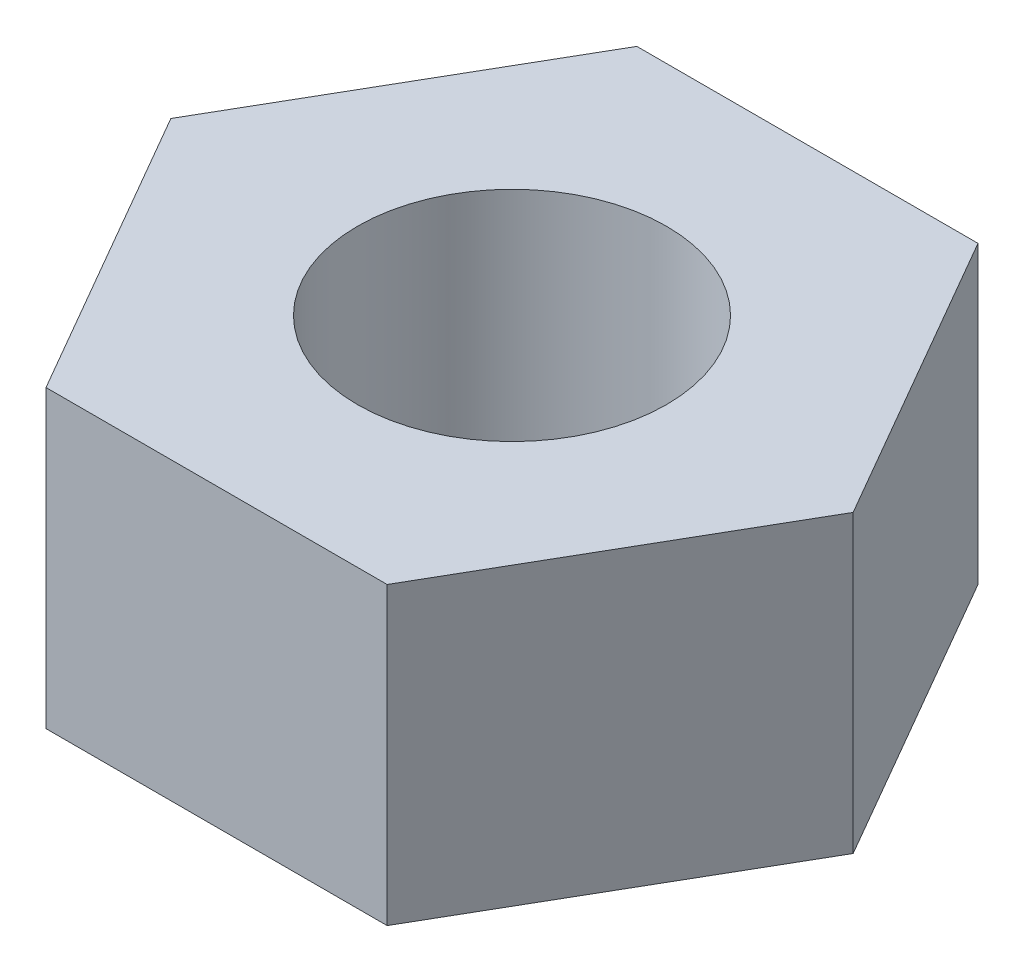
ISO-10303-21;
HEADER;
FILE_DESCRIPTION(('STEP AP214'),'2;1');
FILE_NAME('part.step','',(''),(''),'','','');
FILE_SCHEMA(('AUTOMOTIVE_DESIGN { 1 0 10303 214 1 1 1 1 }'));
ENDSEC;
DATA;
#1=APPLICATION_CONTEXT('core data for automotive mechanical design processes');
#2=APPLICATION_PROTOCOL_DEFINITION('international standard','automotive_design',2000,#1);
#3=PRODUCT_CONTEXT('',#1,'mechanical');
#4=PRODUCT('Part','Part','',(#3));
#5=PRODUCT_RELATED_PRODUCT_CATEGORY('part','',(#4));
#6=PRODUCT_DEFINITION_FORMATION('','',#4);
#7=PRODUCT_DEFINITION_CONTEXT('part definition',#1,'design');
#8=PRODUCT_DEFINITION('design','',#6,#7);
#9=PRODUCT_DEFINITION_SHAPE('','',#8);
#10=(LENGTH_UNIT() NAMED_UNIT(*) SI_UNIT(.MILLI.,.METRE.));
#11=(NAMED_UNIT(*) PLANE_ANGLE_UNIT() SI_UNIT($,.RADIAN.));
#12=(NAMED_UNIT(*) SI_UNIT($,.STERADIAN.) SOLID_ANGLE_UNIT());
#13=UNCERTAINTY_MEASURE_WITH_UNIT(LENGTH_MEASURE(1.E-05),#10,'distance_accuracy_value','');
#14=(GEOMETRIC_REPRESENTATION_CONTEXT(3) GLOBAL_UNCERTAINTY_ASSIGNED_CONTEXT((#13)) GLOBAL_UNIT_ASSIGNED_CONTEXT((#10,
#11,#12)) REPRESENTATION_CONTEXT('',''));
#15=CARTESIAN_POINT('',(0.,0.,0.));
#16=DIRECTION('',(0.,0.,1.));
#17=DIRECTION('',(1.,0.,0.));
#18=AXIS2_PLACEMENT_3D('',#15,#16,#17);
#19=CARTESIAN_POINT('',(7.50555349946512,6.5,-1.05818132034585E-13));
#20=DIRECTION('',(-0.866025403784434,0.,0.500000000000007));
#21=DIRECTION('',(0.500000000000007,0.,0.866025403784435));
#22=AXIS2_PLACEMENT_3D('',#19,#20,#21);
#23=PLANE('',#22);
#24=DIRECTION('',(-0.500000000000007,0.,-0.866025403784434));
#25=VECTOR('',#24,1.);
#26=CARTESIAN_POINT('',(7.50555349946512,0.,-1.05818132034585E-13));
#27=LINE('',#26,#25);
#28=CARTESIAN_POINT('',(7.50555349946512,0.,-1.05818132034585E-13));
#29=VERTEX_POINT('',#28);
#30=CARTESIAN_POINT('',(3.75277674973255,0.,-6.5));
#31=VERTEX_POINT('',#30);
#32=EDGE_CURVE('E117',#29,#31,#27,.T.);
#33=ORIENTED_EDGE('',*,*,#32,.T.);
#34=DIRECTION('',(0.,-1.,0.));
#35=VECTOR('',#34,1.);
#36=CARTESIAN_POINT('',(3.75277674973255,6.5,-6.5));
#37=LINE('',#36,#35);
#38=CARTESIAN_POINT('',(3.75277674973255,6.5,-6.5));
#39=VERTEX_POINT('',#38);
#40=EDGE_CURVE('E11',#39,#31,#37,.T.);
#41=ORIENTED_EDGE('',*,*,#40,.F.);
#42=DIRECTION('',(-0.500000000000007,0.,-0.866025403784434));
#43=VECTOR('',#42,1.);
#44=CARTESIAN_POINT('',(7.50555349946512,6.5,-1.05818132034585E-13));
#45=LINE('',#44,#43);
#46=CARTESIAN_POINT('',(7.50555349946512,6.5,-1.05818132034585E-13));
#47=VERTEX_POINT('',#46);
#48=EDGE_CURVE('E128',#47,#39,#45,.T.);
#49=ORIENTED_EDGE('',*,*,#48,.F.);
#50=DIRECTION('',(0.,-1.,0.));
#51=VECTOR('',#50,1.);
#52=CARTESIAN_POINT('',(7.50555349946512,6.5,-1.05818132034585E-13));
#53=LINE('',#52,#51);
#54=EDGE_CURVE('E113',#47,#29,#53,.T.);
#55=ORIENTED_EDGE('',*,*,#54,.T.);
#56=EDGE_LOOP('',(#33,#41,#49,#55));
#57=FACE_BOUND('',#56,.T.);
#58=ADVANCED_FACE('F33',(#57),#23,.F.);
#59=CARTESIAN_POINT('',(3.75277674973255,6.5,-6.5));
#60=DIRECTION('',(0.,0.,1.));
#61=DIRECTION('',(1.,0.,0.));
#62=AXIS2_PLACEMENT_3D('',#59,#60,#61);
#63=PLANE('',#62);
#64=DIRECTION('',(-1.,0.,0.));
#65=VECTOR('',#64,1.);
#66=CARTESIAN_POINT('',(3.75277674973255,0.,-6.5));
#67=LINE('',#66,#65);
#68=CARTESIAN_POINT('',(-3.75277674973259,0.,-6.49999999999997));
#69=VERTEX_POINT('',#68);
#70=EDGE_CURVE('E120',#31,#69,#67,.T.);
#71=ORIENTED_EDGE('',*,*,#70,.T.);
#72=DIRECTION('',(0.,-1.,0.));
#73=VECTOR('',#72,1.);
#74=CARTESIAN_POINT('',(-3.75277674973259,6.5,-6.49999999999997));
#75=LINE('',#74,#73);
#76=CARTESIAN_POINT('',(-3.75277674973259,6.5,-6.49999999999997));
#77=VERTEX_POINT('',#76);
#78=EDGE_CURVE('E41',#77,#69,#75,.T.);
#79=ORIENTED_EDGE('',*,*,#78,.F.);
#80=DIRECTION('',(-1.,0.,0.));
#81=VECTOR('',#80,1.);
#82=CARTESIAN_POINT('',(3.75277674973255,6.5,-6.5));
#83=LINE('',#82,#81);
#84=EDGE_CURVE('E86',#39,#77,#83,.T.);
#85=ORIENTED_EDGE('',*,*,#84,.F.);
#86=ORIENTED_EDGE('',*,*,#40,.T.);
#87=EDGE_LOOP('',(#71,#79,#85,#86));
#88=FACE_BOUND('',#87,.T.);
#89=ADVANCED_FACE('F153',(#88),#63,.F.);
#90=CARTESIAN_POINT('',(-3.75277674973259,6.5,-6.49999999999997));
#91=DIRECTION('',(0.866025403784442,0.,0.499999999999995));
#92=DIRECTION('',(0.499999999999995,0.,-0.866025403784442));
#93=AXIS2_PLACEMENT_3D('',#90,#91,#92);
#94=PLANE('',#93);
#95=DIRECTION('',(-0.499999999999995,0.,0.866025403784441));
#96=VECTOR('',#95,1.);
#97=CARTESIAN_POINT('',(-3.75277674973259,0.,-6.49999999999997));
#98=LINE('',#97,#96);
#99=CARTESIAN_POINT('',(-7.50555349946512,0.,0.));
#100=VERTEX_POINT('',#99);
#101=EDGE_CURVE('E123',#69,#100,#98,.T.);
#102=ORIENTED_EDGE('',*,*,#101,.T.);
#103=DIRECTION('',(0.,-1.,0.));
#104=VECTOR('',#103,1.);
#105=CARTESIAN_POINT('',(-7.50555349946512,6.5,0.));
#106=LINE('',#105,#104);
#107=CARTESIAN_POINT('',(-7.50555349946512,6.5,0.));
#108=VERTEX_POINT('',#107);
#109=EDGE_CURVE('E108',#108,#100,#106,.T.);
#110=ORIENTED_EDGE('',*,*,#109,.F.);
#111=DIRECTION('',(-0.499999999999995,0.,0.866025403784441));
#112=VECTOR('',#111,1.);
#113=CARTESIAN_POINT('',(-3.75277674973259,6.5,-6.49999999999997));
#114=LINE('',#113,#112);
#115=EDGE_CURVE('E99',#77,#108,#114,.T.);
#116=ORIENTED_EDGE('',*,*,#115,.F.);
#117=ORIENTED_EDGE('',*,*,#78,.T.);
#118=EDGE_LOOP('',(#102,#110,#116,#117));
#119=FACE_BOUND('',#118,.T.);
#120=ADVANCED_FACE('F134',(#119),#94,.F.);
#121=CARTESIAN_POINT('',(-7.50555349946512,6.5,0.));
#122=DIRECTION('',(0.866025403784434,0.,-0.500000000000007));
#123=DIRECTION('',(-0.500000000000007,0.,-0.866025403784435));
#124=AXIS2_PLACEMENT_3D('',#121,#122,#123);
#125=PLANE('',#124);
#126=DIRECTION('',(0.500000000000007,0.,0.866025403784434));
#127=VECTOR('',#126,1.);
#128=CARTESIAN_POINT('',(-7.50555349946512,0.,0.));
#129=LINE('',#128,#127);
#130=CARTESIAN_POINT('',(-3.7527767497325,0.,6.50000000000002));
#131=VERTEX_POINT('',#130);
#132=EDGE_CURVE('E107',#100,#131,#129,.T.);
#133=ORIENTED_EDGE('',*,*,#132,.T.);
#134=DIRECTION('',(0.,-1.,0.));
#135=VECTOR('',#134,1.);
#136=CARTESIAN_POINT('',(-3.7527767497325,6.5,6.50000000000002));
#137=LINE('',#136,#135);
#138=CARTESIAN_POINT('',(-3.7527767497325,6.5,6.50000000000002));
#139=VERTEX_POINT('',#138);
#140=EDGE_CURVE('E104',#139,#131,#137,.T.);
#141=ORIENTED_EDGE('',*,*,#140,.F.);
#142=DIRECTION('',(0.500000000000007,0.,0.866025403784434));
#143=VECTOR('',#142,1.);
#144=CARTESIAN_POINT('',(-7.50555349946512,6.5,0.));
#145=LINE('',#144,#143);
#146=EDGE_CURVE('E93',#108,#139,#145,.T.);
#147=ORIENTED_EDGE('',*,*,#146,.F.);
#148=ORIENTED_EDGE('',*,*,#109,.T.);
#149=EDGE_LOOP('',(#133,#141,#147,#148));
#150=FACE_BOUND('',#149,.T.);
#151=ADVANCED_FACE('F105',(#150),#125,.F.);
#152=CARTESIAN_POINT('',(-3.7527767497325,6.5,6.50000000000002));
#153=DIRECTION('',(0.,0.,-1.));
#154=DIRECTION('',(-1.,0.,0.));
#155=AXIS2_PLACEMENT_3D('',#152,#153,#154);
#156=PLANE('',#155);
#157=DIRECTION('',(1.,0.,0.));
#158=VECTOR('',#157,1.);
#159=CARTESIAN_POINT('',(-3.7527767497325,0.,6.50000000000002));
#160=LINE('',#159,#158);
#161=CARTESIAN_POINT('',(3.75277674973264,0.,6.49999999999994));
#162=VERTEX_POINT('',#161);
#163=EDGE_CURVE('E72',#131,#162,#160,.T.);
#164=ORIENTED_EDGE('',*,*,#163,.T.);
#165=DIRECTION('',(0.,-1.,0.));
#166=VECTOR('',#165,1.);
#167=CARTESIAN_POINT('',(3.75277674973264,6.5,6.49999999999994));
#168=LINE('',#167,#166);
#169=CARTESIAN_POINT('',(3.75277674973264,6.5,6.49999999999994));
#170=VERTEX_POINT('',#169);
#171=EDGE_CURVE('E109',#170,#162,#168,.T.);
#172=ORIENTED_EDGE('',*,*,#171,.F.);
#173=DIRECTION('',(1.,0.,0.));
#174=VECTOR('',#173,1.);
#175=CARTESIAN_POINT('',(-3.7527767497325,6.5,6.50000000000002));
#176=LINE('',#175,#174);
#177=EDGE_CURVE('E97',#139,#170,#176,.T.);
#178=ORIENTED_EDGE('',*,*,#177,.F.);
#179=ORIENTED_EDGE('',*,*,#140,.T.);
#180=EDGE_LOOP('',(#164,#172,#178,#179));
#181=FACE_BOUND('',#180,.T.);
#182=ADVANCED_FACE('F111',(#181),#156,.F.);
#183=CARTESIAN_POINT('',(3.75277674973264,6.5,6.49999999999994));
#184=DIRECTION('',(-0.866025403784445,0.,-0.499999999999989));
#185=DIRECTION('',(-0.499999999999989,0.,0.866025403784445));
#186=AXIS2_PLACEMENT_3D('',#183,#184,#185);
#187=PLANE('',#186);
#188=DIRECTION('',(0.499999999999989,0.,-0.866025403784445));
#189=VECTOR('',#188,1.);
#190=CARTESIAN_POINT('',(3.75277674973264,0.,6.49999999999994));
#191=LINE('',#190,#189);
#192=EDGE_CURVE('E78',#162,#29,#191,.T.);
#193=ORIENTED_EDGE('',*,*,#192,.T.);
#194=ORIENTED_EDGE('',*,*,#54,.F.);
#195=DIRECTION('',(0.499999999999989,0.,-0.866025403784445));
#196=VECTOR('',#195,1.);
#197=CARTESIAN_POINT('',(3.75277674973264,6.5,6.49999999999994));
#198=LINE('',#197,#196);
#199=EDGE_CURVE('E49',#170,#47,#198,.T.);
#200=ORIENTED_EDGE('',*,*,#199,.F.);
#201=ORIENTED_EDGE('',*,*,#171,.T.);
#202=EDGE_LOOP('',(#193,#194,#200,#201));
#203=FACE_BOUND('',#202,.T.);
#204=ADVANCED_FACE('F141',(#203),#187,.F.);
#205=CARTESIAN_POINT('',(0.,6.5,0.));
#206=DIRECTION('',(0.,1.,0.));
#207=DIRECTION('',(0.,0.,1.));
#208=AXIS2_PLACEMENT_3D('',#205,#206,#207);
#209=PLANE('',#208);
#210=CARTESIAN_POINT('',(0.,6.5,0.));
#211=DIRECTION('',(0.,1.,0.));
#212=DIRECTION('',(0.,0.,1.));
#213=AXIS2_PLACEMENT_3D('',#210,#211,#212);
#214=CIRCLE('',#213,3.4);
#215=CARTESIAN_POINT('',(0.,6.5,3.4));
#216=VERTEX_POINT('',#215);
#217=EDGE_CURVE('E208',#216,#216,#214,.T.);
#218=ORIENTED_EDGE('',*,*,#217,.F.);
#219=EDGE_LOOP('',(#218));
#220=FACE_BOUND('',#219,.T.);
#221=ORIENTED_EDGE('',*,*,#48,.T.);
#222=ORIENTED_EDGE('',*,*,#84,.T.);
#223=ORIENTED_EDGE('',*,*,#115,.T.);
#224=ORIENTED_EDGE('',*,*,#146,.T.);
#225=ORIENTED_EDGE('',*,*,#177,.T.);
#226=ORIENTED_EDGE('',*,*,#199,.T.);
#227=EDGE_LOOP('',(#221,#222,#223,#224,#225,#226));
#228=FACE_BOUND('',#227,.T.);
#229=ADVANCED_FACE('F95',(#220,#228),#209,.T.);
#230=CARTESIAN_POINT('',(0.,0.,0.));
#231=DIRECTION('',(0.,1.,0.));
#232=DIRECTION('',(0.,0.,1.));
#233=AXIS2_PLACEMENT_3D('',#230,#231,#232);
#234=PLANE('',#233);
#235=CARTESIAN_POINT('',(0.,0.,0.));
#236=DIRECTION('',(0.,1.,0.));
#237=DIRECTION('',(0.,0.,1.));
#238=AXIS2_PLACEMENT_3D('',#235,#236,#237);
#239=CIRCLE('',#238,3.4);
#240=CARTESIAN_POINT('',(0.,0.,3.4));
#241=VERTEX_POINT('',#240);
#242=EDGE_CURVE('E121',#241,#241,#239,.T.);
#243=ORIENTED_EDGE('',*,*,#242,.T.);
#244=EDGE_LOOP('',(#243));
#245=FACE_BOUND('',#244,.T.);
#246=ORIENTED_EDGE('',*,*,#32,.F.);
#247=ORIENTED_EDGE('',*,*,#192,.F.);
#248=ORIENTED_EDGE('',*,*,#163,.F.);
#249=ORIENTED_EDGE('',*,*,#132,.F.);
#250=ORIENTED_EDGE('',*,*,#101,.F.);
#251=ORIENTED_EDGE('',*,*,#70,.F.);
#252=EDGE_LOOP('',(#246,#247,#248,#249,#250,#251));
#253=FACE_BOUND('',#252,.T.);
#254=ADVANCED_FACE('F137',(#245,#253),#234,.F.);
#255=CARTESIAN_POINT('',(0.,6.5,0.));
#256=DIRECTION('',(0.,1.,0.));
#257=DIRECTION('',(0.,0.,1.));
#258=AXIS2_PLACEMENT_3D('',#255,#256,#257);
#259=CYLINDRICAL_SURFACE('',#258,3.4);
#260=ORIENTED_EDGE('',*,*,#242,.F.);
#261=EDGE_LOOP('',(#260));
#262=FACE_BOUND('',#261,.T.);
#263=ORIENTED_EDGE('',*,*,#217,.T.);
#264=EDGE_LOOP('',(#263));
#265=FACE_BOUND('',#264,.T.);
#266=ADVANCED_FACE('F190',(#262,#265),#259,.F.);
#267=CLOSED_SHELL('',(#58,#89,#120,#151,#182,#204,#229,#254,#266));
#268=MANIFOLD_SOLID_BREP('B2',#267);
#269=ADVANCED_BREP_SHAPE_REPRESENTATION('',(#18,#268),#14);
#270=SHAPE_DEFINITION_REPRESENTATION(#9,#269);
ENDSEC;
END-ISO-10303-21;
